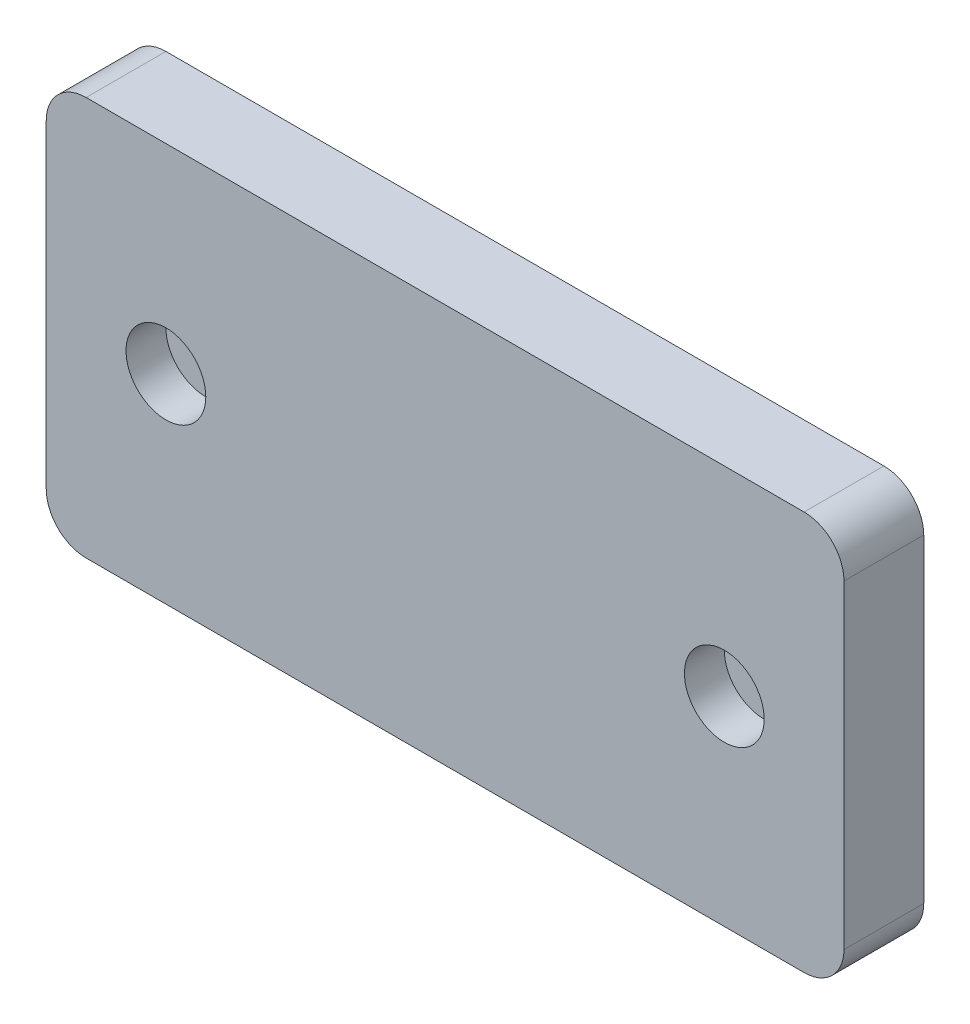
ISO-10303-21;
HEADER;
FILE_DESCRIPTION(('STEP AP214'),'2;1');
FILE_NAME('part.step','',(''),(''),'','','');
FILE_SCHEMA(('AUTOMOTIVE_DESIGN { 1 0 10303 214 1 1 1 1 }'));
ENDSEC;
DATA;
#1=APPLICATION_CONTEXT('core data for automotive mechanical design processes');
#2=APPLICATION_PROTOCOL_DEFINITION('international standard','automotive_design',2000,#1);
#3=PRODUCT_CONTEXT('',#1,'mechanical');
#4=PRODUCT('Part','Part','',(#3));
#5=PRODUCT_RELATED_PRODUCT_CATEGORY('part','',(#4));
#6=PRODUCT_DEFINITION_FORMATION('','',#4);
#7=PRODUCT_DEFINITION_CONTEXT('part definition',#1,'design');
#8=PRODUCT_DEFINITION('design','',#6,#7);
#9=PRODUCT_DEFINITION_SHAPE('','',#8);
#10=(LENGTH_UNIT() NAMED_UNIT(*) SI_UNIT(.MILLI.,.METRE.));
#11=(NAMED_UNIT(*) PLANE_ANGLE_UNIT() SI_UNIT($,.RADIAN.));
#12=(NAMED_UNIT(*) SI_UNIT($,.STERADIAN.) SOLID_ANGLE_UNIT());
#13=UNCERTAINTY_MEASURE_WITH_UNIT(LENGTH_MEASURE(1.E-05),#10,'distance_accuracy_value','');
#14=(GEOMETRIC_REPRESENTATION_CONTEXT(3) GLOBAL_UNCERTAINTY_ASSIGNED_CONTEXT((#13)) GLOBAL_UNIT_ASSIGNED_CONTEXT((#10,
#11,#12)) REPRESENTATION_CONTEXT('',''));
#15=CARTESIAN_POINT('',(0.,0.,0.));
#16=DIRECTION('',(0.,0.,1.));
#17=DIRECTION('',(1.,0.,0.));
#18=AXIS2_PLACEMENT_3D('',#15,#16,#17);
#19=CARTESIAN_POINT('',(5000.,-2500.,1000.));
#20=DIRECTION('',(-1.,0.,0.));
#21=DIRECTION('',(0.,0.,1.));
#22=AXIS2_PLACEMENT_3D('',#19,#20,#21);
#23=PLANE('',#22);
#24=DIRECTION('',(0.,1.,0.));
#25=VECTOR('',#24,1.);
#26=CARTESIAN_POINT('',(5000.,-2500.,1000.));
#27=LINE('',#26,#25);
#28=CARTESIAN_POINT('',(5000.,-2000.,1000.));
#29=VERTEX_POINT('',#28);
#30=CARTESIAN_POINT('',(5000.,2000.,1000.));
#31=VERTEX_POINT('',#30);
#32=EDGE_CURVE('E128',#29,#31,#27,.T.);
#33=ORIENTED_EDGE('',*,*,#32,.F.);
#34=DIRECTION('',(0.,0.,-1.));
#35=VECTOR('',#34,1.);
#36=CARTESIAN_POINT('',(5000.,-2000.,1000.));
#37=LINE('',#36,#35);
#38=CARTESIAN_POINT('',(5000.,-2000.,0.));
#39=VERTEX_POINT('',#38);
#40=EDGE_CURVE('E40',#29,#39,#37,.T.);
#41=ORIENTED_EDGE('',*,*,#40,.T.);
#42=DIRECTION('',(0.,1.,0.));
#43=VECTOR('',#42,1.);
#44=CARTESIAN_POINT('',(5000.,-2500.,0.));
#45=LINE('',#44,#43);
#46=CARTESIAN_POINT('',(5000.,2000.,0.));
#47=VERTEX_POINT('',#46);
#48=EDGE_CURVE('E130',#39,#47,#45,.T.);
#49=ORIENTED_EDGE('',*,*,#48,.T.);
#50=DIRECTION('',(0.,0.,-1.));
#51=VECTOR('',#50,1.);
#52=CARTESIAN_POINT('',(5000.,2000.,1000.));
#53=LINE('',#52,#51);
#54=EDGE_CURVE('E47',#47,#31,#53,.F.);
#55=ORIENTED_EDGE('',*,*,#54,.T.);
#56=EDGE_LOOP('',(#33,#41,#49,#55));
#57=FACE_BOUND('',#56,.T.);
#58=ADVANCED_FACE('F32',(#57),#23,.F.);
#59=CARTESIAN_POINT('',(-5000.,2500.,1000.));
#60=DIRECTION('',(0.,-1.,0.));
#61=DIRECTION('',(0.,0.,-1.));
#62=AXIS2_PLACEMENT_3D('',#59,#60,#61);
#63=PLANE('',#62);
#64=DIRECTION('',(-1.,0.,0.));
#65=VECTOR('',#64,1.);
#66=CARTESIAN_POINT('',(-5000.,2500.,1000.));
#67=LINE('',#66,#65);
#68=CARTESIAN_POINT('',(4500.,2500.,1000.));
#69=VERTEX_POINT('',#68);
#70=CARTESIAN_POINT('',(-4500.,2500.,1000.));
#71=VERTEX_POINT('',#70);
#72=EDGE_CURVE('E165',#69,#71,#67,.T.);
#73=ORIENTED_EDGE('',*,*,#72,.F.);
#74=DIRECTION('',(0.,0.,-1.));
#75=VECTOR('',#74,1.);
#76=CARTESIAN_POINT('',(4500.,2500.,1000.));
#77=LINE('',#76,#75);
#78=CARTESIAN_POINT('',(4500.,2500.,0.));
#79=VERTEX_POINT('',#78);
#80=EDGE_CURVE('E11',#69,#79,#77,.T.);
#81=ORIENTED_EDGE('',*,*,#80,.T.);
#82=DIRECTION('',(-1.,0.,0.));
#83=VECTOR('',#82,1.);
#84=CARTESIAN_POINT('',(-5000.,2500.,0.));
#85=LINE('',#84,#83);
#86=CARTESIAN_POINT('',(-4500.,2500.,0.));
#87=VERTEX_POINT('',#86);
#88=EDGE_CURVE('E125',#79,#87,#85,.T.);
#89=ORIENTED_EDGE('',*,*,#88,.T.);
#90=DIRECTION('',(0.,0.,-1.));
#91=VECTOR('',#90,1.);
#92=CARTESIAN_POINT('',(-4500.,2500.,1000.));
#93=LINE('',#92,#91);
#94=EDGE_CURVE('E106',#87,#71,#93,.F.);
#95=ORIENTED_EDGE('',*,*,#94,.T.);
#96=EDGE_LOOP('',(#73,#81,#89,#95));
#97=FACE_BOUND('',#96,.T.);
#98=ADVANCED_FACE('F209',(#97),#63,.F.);
#99=CARTESIAN_POINT('',(-5000.,-2500.,1000.));
#100=DIRECTION('',(1.,0.,0.));
#101=DIRECTION('',(0.,0.,-1.));
#102=AXIS2_PLACEMENT_3D('',#99,#100,#101);
#103=PLANE('',#102);
#104=DIRECTION('',(0.,-1.,0.));
#105=VECTOR('',#104,1.);
#106=CARTESIAN_POINT('',(-5000.,-2500.,0.));
#107=LINE('',#106,#105);
#108=CARTESIAN_POINT('',(-5000.,2000.,0.));
#109=VERTEX_POINT('',#108);
#110=CARTESIAN_POINT('',(-5000.,-2000.,0.));
#111=VERTEX_POINT('',#110);
#112=EDGE_CURVE('E115',#109,#111,#107,.T.);
#113=ORIENTED_EDGE('',*,*,#112,.T.);
#114=DIRECTION('',(0.,0.,-1.));
#115=VECTOR('',#114,1.);
#116=CARTESIAN_POINT('',(-5000.,-2000.,1000.));
#117=LINE('',#116,#115);
#118=CARTESIAN_POINT('',(-5000.,-2000.,1000.));
#119=VERTEX_POINT('',#118);
#120=EDGE_CURVE('E147',#111,#119,#117,.F.);
#121=ORIENTED_EDGE('',*,*,#120,.T.);
#122=DIRECTION('',(0.,-1.,0.));
#123=VECTOR('',#122,1.);
#124=CARTESIAN_POINT('',(-5000.,-2500.,1000.));
#125=LINE('',#124,#123);
#126=CARTESIAN_POINT('',(-5000.,2000.,1000.));
#127=VERTEX_POINT('',#126);
#128=EDGE_CURVE('E118',#127,#119,#125,.T.);
#129=ORIENTED_EDGE('',*,*,#128,.F.);
#130=DIRECTION('',(0.,0.,-1.));
#131=VECTOR('',#130,1.);
#132=CARTESIAN_POINT('',(-5000.,2000.,1000.));
#133=LINE('',#132,#131);
#134=EDGE_CURVE('E104',#127,#109,#133,.T.);
#135=ORIENTED_EDGE('',*,*,#134,.T.);
#136=EDGE_LOOP('',(#113,#121,#129,#135));
#137=FACE_BOUND('',#136,.T.);
#138=ADVANCED_FACE('F114',(#137),#103,.F.);
#139=CARTESIAN_POINT('',(-5000.,-2500.,1000.));
#140=DIRECTION('',(0.,1.,0.));
#141=DIRECTION('',(0.,0.,1.));
#142=AXIS2_PLACEMENT_3D('',#139,#140,#141);
#143=PLANE('',#142);
#144=DIRECTION('',(1.,0.,0.));
#145=VECTOR('',#144,1.);
#146=CARTESIAN_POINT('',(-5000.,-2500.,1000.));
#147=LINE('',#146,#145);
#148=CARTESIAN_POINT('',(-4500.,-2500.,1000.));
#149=VERTEX_POINT('',#148);
#150=CARTESIAN_POINT('',(4500.,-2500.,1000.));
#151=VERTEX_POINT('',#150);
#152=EDGE_CURVE('E119',#149,#151,#147,.T.);
#153=ORIENTED_EDGE('',*,*,#152,.F.);
#154=DIRECTION('',(0.,0.,-1.));
#155=VECTOR('',#154,1.);
#156=CARTESIAN_POINT('',(-4500.,-2500.,1000.));
#157=LINE('',#156,#155);
#158=CARTESIAN_POINT('',(-4500.,-2500.,0.));
#159=VERTEX_POINT('',#158);
#160=EDGE_CURVE('E139',#149,#159,#157,.T.);
#161=ORIENTED_EDGE('',*,*,#160,.T.);
#162=DIRECTION('',(1.,0.,0.));
#163=VECTOR('',#162,1.);
#164=CARTESIAN_POINT('',(-5000.,-2500.,0.));
#165=LINE('',#164,#163);
#166=CARTESIAN_POINT('',(4500.,-2500.,0.));
#167=VERTEX_POINT('',#166);
#168=EDGE_CURVE('E124',#159,#167,#165,.T.);
#169=ORIENTED_EDGE('',*,*,#168,.T.);
#170=DIRECTION('',(0.,0.,-1.));
#171=VECTOR('',#170,1.);
#172=CARTESIAN_POINT('',(4500.,-2500.,1000.));
#173=LINE('',#172,#171);
#174=EDGE_CURVE('E137',#167,#151,#173,.F.);
#175=ORIENTED_EDGE('',*,*,#174,.T.);
#176=EDGE_LOOP('',(#153,#161,#169,#175));
#177=FACE_BOUND('',#176,.T.);
#178=ADVANCED_FACE('F189',(#177),#143,.F.);
#179=CARTESIAN_POINT('',(0.,0.,1000.));
#180=DIRECTION('',(0.,0.,-1.));
#181=DIRECTION('',(-1.,0.,0.));
#182=AXIS2_PLACEMENT_3D('',#179,#180,#181);
#183=PLANE('',#182);
#184=CARTESIAN_POINT('',(3500.,0.,1000.));
#185=DIRECTION('',(0.,0.,1.));
#186=DIRECTION('',(1.,0.,0.));
#187=AXIS2_PLACEMENT_3D('',#184,#185,#186);
#188=CIRCLE('',#187,500.);
#189=CARTESIAN_POINT('',(4000.,0.,1000.));
#190=VERTEX_POINT('',#189);
#191=EDGE_CURVE('E171',#190,#190,#188,.T.);
#192=ORIENTED_EDGE('',*,*,#191,.F.);
#193=EDGE_LOOP('',(#192));
#194=FACE_BOUND('',#193,.T.);
#195=CARTESIAN_POINT('',(-3500.,0.,1000.));
#196=DIRECTION('',(0.,0.,1.));
#197=DIRECTION('',(1.,0.,0.));
#198=AXIS2_PLACEMENT_3D('',#195,#196,#197);
#199=CIRCLE('',#198,500.);
#200=CARTESIAN_POINT('',(-3000.,0.,1000.));
#201=VERTEX_POINT('',#200);
#202=EDGE_CURVE('E160',#201,#201,#199,.T.);
#203=ORIENTED_EDGE('',*,*,#202,.F.);
#204=EDGE_LOOP('',(#203));
#205=FACE_BOUND('',#204,.T.);
#206=ORIENTED_EDGE('',*,*,#128,.T.);
#207=CARTESIAN_POINT('',(-4500.,-2000.,1000.));
#208=DIRECTION('',(0.,0.,-1.));
#209=DIRECTION('',(-1.,0.,0.));
#210=AXIS2_PLACEMENT_3D('',#207,#208,#209);
#211=CIRCLE('',#210,500.);
#212=EDGE_CURVE('E152',#119,#149,#211,.F.);
#213=ORIENTED_EDGE('',*,*,#212,.T.);
#214=ORIENTED_EDGE('',*,*,#152,.T.);
#215=CARTESIAN_POINT('',(4500.,-2000.,1000.));
#216=DIRECTION('',(0.,0.,-1.));
#217=DIRECTION('',(-1.,0.,0.));
#218=AXIS2_PLACEMENT_3D('',#215,#216,#217);
#219=CIRCLE('',#218,500.);
#220=EDGE_CURVE('E54',#151,#29,#219,.F.);
#221=ORIENTED_EDGE('',*,*,#220,.T.);
#222=ORIENTED_EDGE('',*,*,#32,.T.);
#223=CARTESIAN_POINT('',(4500.,2000.,1000.));
#224=DIRECTION('',(0.,0.,-1.));
#225=DIRECTION('',(-1.,0.,0.));
#226=AXIS2_PLACEMENT_3D('',#223,#224,#225);
#227=CIRCLE('',#226,500.);
#228=EDGE_CURVE('E149',#31,#69,#227,.F.);
#229=ORIENTED_EDGE('',*,*,#228,.T.);
#230=ORIENTED_EDGE('',*,*,#72,.T.);
#231=CARTESIAN_POINT('',(-4500.,2000.,1000.));
#232=DIRECTION('',(0.,0.,-1.));
#233=DIRECTION('',(-1.,0.,0.));
#234=AXIS2_PLACEMENT_3D('',#231,#232,#233);
#235=CIRCLE('',#234,500.);
#236=EDGE_CURVE('E135',#71,#127,#235,.F.);
#237=ORIENTED_EDGE('',*,*,#236,.T.);
#238=EDGE_LOOP('',(#206,#213,#214,#221,#222,#229,#230,#237));
#239=FACE_BOUND('',#238,.T.);
#240=ADVANCED_FACE('F186',(#194,#205,#239),#183,.F.);
#241=CARTESIAN_POINT('',(0.,0.,0.));
#242=DIRECTION('',(0.,0.,-1.));
#243=DIRECTION('',(-1.,0.,0.));
#244=AXIS2_PLACEMENT_3D('',#241,#242,#243);
#245=PLANE('',#244);
#246=ORIENTED_EDGE('',*,*,#168,.F.);
#247=CARTESIAN_POINT('',(-4500.,-2000.,0.));
#248=DIRECTION('',(0.,0.,-1.));
#249=DIRECTION('',(-1.,0.,0.));
#250=AXIS2_PLACEMENT_3D('',#247,#248,#249);
#251=CIRCLE('',#250,500.);
#252=EDGE_CURVE('E123',#159,#111,#251,.T.);
#253=ORIENTED_EDGE('',*,*,#252,.T.);
#254=ORIENTED_EDGE('',*,*,#112,.F.);
#255=CARTESIAN_POINT('',(-4500.,2000.,0.));
#256=DIRECTION('',(0.,0.,-1.));
#257=DIRECTION('',(-1.,0.,0.));
#258=AXIS2_PLACEMENT_3D('',#255,#256,#257);
#259=CIRCLE('',#258,500.);
#260=EDGE_CURVE('E100',#109,#87,#259,.T.);
#261=ORIENTED_EDGE('',*,*,#260,.T.);
#262=ORIENTED_EDGE('',*,*,#88,.F.);
#263=CARTESIAN_POINT('',(4500.,2000.,0.));
#264=DIRECTION('',(0.,0.,-1.));
#265=DIRECTION('',(-1.,0.,0.));
#266=AXIS2_PLACEMENT_3D('',#263,#264,#265);
#267=CIRCLE('',#266,500.);
#268=EDGE_CURVE('E142',#79,#47,#267,.T.);
#269=ORIENTED_EDGE('',*,*,#268,.T.);
#270=ORIENTED_EDGE('',*,*,#48,.F.);
#271=CARTESIAN_POINT('',(4500.,-2000.,0.));
#272=DIRECTION('',(0.,0.,-1.));
#273=DIRECTION('',(-1.,0.,0.));
#274=AXIS2_PLACEMENT_3D('',#271,#272,#273);
#275=CIRCLE('',#274,500.);
#276=EDGE_CURVE('E144',#39,#167,#275,.T.);
#277=ORIENTED_EDGE('',*,*,#276,.T.);
#278=EDGE_LOOP('',(#246,#253,#254,#261,#262,#269,#270,#277));
#279=FACE_BOUND('',#278,.T.);
#280=ADVANCED_FACE('F122',(#279),#245,.T.);
#281=CARTESIAN_POINT('',(-4500.,2000.,1000.));
#282=DIRECTION('',(0.,0.,-1.));
#283=DIRECTION('',(-1.,0.,0.));
#284=AXIS2_PLACEMENT_3D('',#281,#282,#283);
#285=CYLINDRICAL_SURFACE('',#284,500.);
#286=ORIENTED_EDGE('',*,*,#236,.F.);
#287=ORIENTED_EDGE('',*,*,#94,.F.);
#288=ORIENTED_EDGE('',*,*,#260,.F.);
#289=ORIENTED_EDGE('',*,*,#134,.F.);
#290=EDGE_LOOP('',(#286,#287,#288,#289));
#291=FACE_BOUND('',#290,.T.);
#292=ADVANCED_FACE('F103',(#291),#285,.T.);
#293=CARTESIAN_POINT('',(-4500.,-2000.,1000.));
#294=DIRECTION('',(0.,0.,-1.));
#295=DIRECTION('',(-1.,0.,0.));
#296=AXIS2_PLACEMENT_3D('',#293,#294,#295);
#297=CYLINDRICAL_SURFACE('',#296,500.);
#298=ORIENTED_EDGE('',*,*,#212,.F.);
#299=ORIENTED_EDGE('',*,*,#120,.F.);
#300=ORIENTED_EDGE('',*,*,#252,.F.);
#301=ORIENTED_EDGE('',*,*,#160,.F.);
#302=EDGE_LOOP('',(#298,#299,#300,#301));
#303=FACE_BOUND('',#302,.T.);
#304=ADVANCED_FACE('F196',(#303),#297,.T.);
#305=CARTESIAN_POINT('',(4500.,-2000.,1000.));
#306=DIRECTION('',(0.,0.,-1.));
#307=DIRECTION('',(-1.,0.,0.));
#308=AXIS2_PLACEMENT_3D('',#305,#306,#307);
#309=CYLINDRICAL_SURFACE('',#308,500.);
#310=ORIENTED_EDGE('',*,*,#220,.F.);
#311=ORIENTED_EDGE('',*,*,#174,.F.);
#312=ORIENTED_EDGE('',*,*,#276,.F.);
#313=ORIENTED_EDGE('',*,*,#40,.F.);
#314=EDGE_LOOP('',(#310,#311,#312,#313));
#315=FACE_BOUND('',#314,.T.);
#316=ADVANCED_FACE('F199',(#315),#309,.T.);
#317=CARTESIAN_POINT('',(4500.,2000.,1000.));
#318=DIRECTION('',(0.,0.,-1.));
#319=DIRECTION('',(-1.,0.,0.));
#320=AXIS2_PLACEMENT_3D('',#317,#318,#319);
#321=CYLINDRICAL_SURFACE('',#320,500.);
#322=ORIENTED_EDGE('',*,*,#228,.F.);
#323=ORIENTED_EDGE('',*,*,#54,.F.);
#324=ORIENTED_EDGE('',*,*,#268,.F.);
#325=ORIENTED_EDGE('',*,*,#80,.F.);
#326=EDGE_LOOP('',(#322,#323,#324,#325));
#327=FACE_BOUND('',#326,.T.);
#328=ADVANCED_FACE('F34',(#327),#321,.T.);
#329=CARTESIAN_POINT('',(-3500.,0.,500.));
#330=DIRECTION('',(0.,0.,1.));
#331=DIRECTION('',(1.,0.,0.));
#332=AXIS2_PLACEMENT_3D('',#329,#330,#331);
#333=CYLINDRICAL_SURFACE('',#332,500.);
#334=CARTESIAN_POINT('',(-3500.,0.,500.));
#335=DIRECTION('',(0.,0.,1.));
#336=DIRECTION('',(1.,0.,0.));
#337=AXIS2_PLACEMENT_3D('',#334,#335,#336);
#338=CIRCLE('',#337,500.);
#339=CARTESIAN_POINT('',(-3000.,0.,500.));
#340=VERTEX_POINT('',#339);
#341=EDGE_CURVE('E158',#340,#340,#338,.T.);
#342=ORIENTED_EDGE('',*,*,#341,.F.);
#343=EDGE_LOOP('',(#342));
#344=FACE_BOUND('',#343,.T.);
#345=ORIENTED_EDGE('',*,*,#202,.T.);
#346=EDGE_LOOP('',(#345));
#347=FACE_BOUND('',#346,.T.);
#348=ADVANCED_FACE('F205',(#344,#347),#333,.F.);
#349=CARTESIAN_POINT('',(-3500.,0.,500.));
#350=DIRECTION('',(0.,0.,1.));
#351=DIRECTION('',(1.,0.,0.));
#352=AXIS2_PLACEMENT_3D('',#349,#350,#351);
#353=PLANE('',#352);
#354=ORIENTED_EDGE('',*,*,#341,.T.);
#355=EDGE_LOOP('',(#354));
#356=FACE_BOUND('',#355,.T.);
#357=ADVANCED_FACE('F182',(#356),#353,.T.);
#358=CARTESIAN_POINT('',(3500.,0.,500.));
#359=DIRECTION('',(0.,0.,1.));
#360=DIRECTION('',(1.,0.,0.));
#361=AXIS2_PLACEMENT_3D('',#358,#359,#360);
#362=CYLINDRICAL_SURFACE('',#361,500.);
#363=CARTESIAN_POINT('',(3500.,0.,500.));
#364=DIRECTION('',(0.,0.,1.));
#365=DIRECTION('',(1.,0.,0.));
#366=AXIS2_PLACEMENT_3D('',#363,#364,#365);
#367=CIRCLE('',#366,500.);
#368=CARTESIAN_POINT('',(4000.,0.,500.));
#369=VERTEX_POINT('',#368);
#370=EDGE_CURVE('E169',#369,#369,#367,.T.);
#371=ORIENTED_EDGE('',*,*,#370,.F.);
#372=EDGE_LOOP('',(#371));
#373=FACE_BOUND('',#372,.T.);
#374=ORIENTED_EDGE('',*,*,#191,.T.);
#375=EDGE_LOOP('',(#374));
#376=FACE_BOUND('',#375,.T.);
#377=ADVANCED_FACE('F179',(#373,#376),#362,.F.);
#378=CARTESIAN_POINT('',(3500.,0.,500.));
#379=DIRECTION('',(0.,0.,1.));
#380=DIRECTION('',(1.,0.,0.));
#381=AXIS2_PLACEMENT_3D('',#378,#379,#380);
#382=PLANE('',#381);
#383=ORIENTED_EDGE('',*,*,#370,.T.);
#384=EDGE_LOOP('',(#383));
#385=FACE_BOUND('',#384,.T.);
#386=ADVANCED_FACE('F177',(#385),#382,.T.);
#387=CLOSED_SHELL('',(#58,#98,#138,#178,#240,#280,#292,#304,#316,#328,#348,#357,#377,#386));
#388=MANIFOLD_SOLID_BREP('B2',#387);
#389=ADVANCED_BREP_SHAPE_REPRESENTATION('',(#18,#388),#14);
#390=SHAPE_DEFINITION_REPRESENTATION(#9,#389);
ENDSEC;
END-ISO-10303-21;
